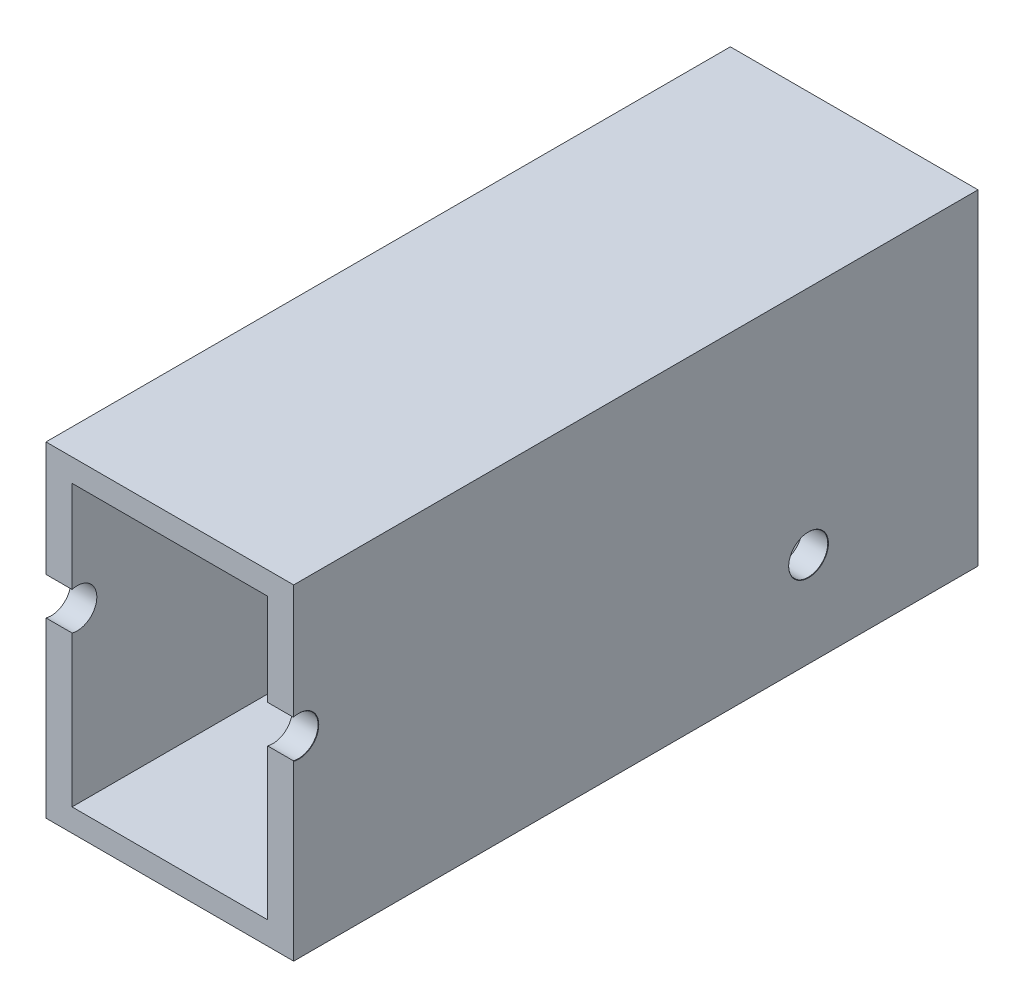
ISO-10303-21;
HEADER;
FILE_DESCRIPTION(('STEP AP214'),'2;1');
FILE_NAME('part.step','',(''),(''),'','','');
FILE_SCHEMA(('AUTOMOTIVE_DESIGN { 1 0 10303 214 1 1 1 1 }'));
ENDSEC;
DATA;
#1=APPLICATION_CONTEXT('core data for automotive mechanical design processes');
#2=APPLICATION_PROTOCOL_DEFINITION('international standard','automotive_design',2000,#1);
#3=PRODUCT_CONTEXT('',#1,'mechanical');
#4=PRODUCT('Part','Part','',(#3));
#5=PRODUCT_RELATED_PRODUCT_CATEGORY('part','',(#4));
#6=PRODUCT_DEFINITION_FORMATION('','',#4);
#7=PRODUCT_DEFINITION_CONTEXT('part definition',#1,'design');
#8=PRODUCT_DEFINITION('design','',#6,#7);
#9=PRODUCT_DEFINITION_SHAPE('','',#8);
#10=(LENGTH_UNIT() NAMED_UNIT(*) SI_UNIT(.MILLI.,.METRE.));
#11=(NAMED_UNIT(*) PLANE_ANGLE_UNIT() SI_UNIT($,.RADIAN.));
#12=(NAMED_UNIT(*) SI_UNIT($,.STERADIAN.) SOLID_ANGLE_UNIT());
#13=UNCERTAINTY_MEASURE_WITH_UNIT(LENGTH_MEASURE(1.E-05),#10,'distance_accuracy_value','');
#14=(GEOMETRIC_REPRESENTATION_CONTEXT(3) GLOBAL_UNCERTAINTY_ASSIGNED_CONTEXT((#13)) GLOBAL_UNIT_ASSIGNED_CONTEXT((#10,
#11,#12)) REPRESENTATION_CONTEXT('',''));
#15=CARTESIAN_POINT('',(0.,0.,0.));
#16=DIRECTION('',(0.,0.,1.));
#17=DIRECTION('',(1.,0.,0.));
#18=AXIS2_PLACEMENT_3D('',#15,#16,#17);
#19=CARTESIAN_POINT('',(-7.5,0.,21.25));
#20=DIRECTION('',(0.,0.,-1.));
#21=DIRECTION('',(0.,1.,0.));
#22=AXIS2_PLACEMENT_3D('',#19,#20,#21);
#23=PLANE('',#22);
#24=DIRECTION('',(0.,-1.,0.));
#25=VECTOR('',#24,1.);
#26=CARTESIAN_POINT('',(-9.5,0.,21.25));
#27=LINE('',#26,#25);
#28=CARTESIAN_POINT('',(-9.5,12.5,21.25));
#29=VERTEX_POINT('',#28);
#30=CARTESIAN_POINT('',(-9.5,3.69568322948009,21.25));
#31=VERTEX_POINT('',#30);
#32=EDGE_CURVE('E191',#29,#31,#27,.T.);
#33=ORIENTED_EDGE('',*,*,#32,.T.);
#34=DIRECTION('',(1.,0.,0.));
#35=VECTOR('',#34,1.);
#36=CARTESIAN_POINT('',(9.5,3.69568322948009,21.25));
#37=LINE('',#36,#35);
#38=CARTESIAN_POINT('',(-7.5,3.69568322948009,21.25));
#39=VERTEX_POINT('',#38);
#40=EDGE_CURVE('E51',#31,#39,#37,.T.);
#41=ORIENTED_EDGE('',*,*,#40,.T.);
#42=DIRECTION('',(0.,-1.,0.));
#43=VECTOR('',#42,1.);
#44=CARTESIAN_POINT('',(-7.5,0.,21.25));
#45=LINE('',#44,#43);
#46=CARTESIAN_POINT('',(-7.5,10.75,21.25));
#47=VERTEX_POINT('',#46);
#48=EDGE_CURVE('E312',#47,#39,#45,.T.);
#49=ORIENTED_EDGE('',*,*,#48,.F.);
#50=DIRECTION('',(1.,0.,0.));
#51=VECTOR('',#50,1.);
#52=CARTESIAN_POINT('',(-7.5,10.75,21.25));
#53=LINE('',#52,#51);
#54=CARTESIAN_POINT('',(7.5,10.75,21.25));
#55=VERTEX_POINT('',#54);
#56=EDGE_CURVE('E242',#47,#55,#53,.T.);
#57=ORIENTED_EDGE('',*,*,#56,.T.);
#58=DIRECTION('',(0.,-1.,0.));
#59=VECTOR('',#58,1.);
#60=CARTESIAN_POINT('',(7.5,0.,21.25));
#61=LINE('',#60,#59);
#62=CARTESIAN_POINT('',(7.5,3.69568322948009,21.25));
#63=VERTEX_POINT('',#62);
#64=EDGE_CURVE('E169',#55,#63,#61,.T.);
#65=ORIENTED_EDGE('',*,*,#64,.T.);
#66=CARTESIAN_POINT('',(9.475,3.69568322948009,21.25));
#67=VERTEX_POINT('',#66);
#68=EDGE_CURVE('E154',#63,#67,#37,.T.);
#69=ORIENTED_EDGE('',*,*,#68,.T.);
#70=CARTESIAN_POINT('',(11.3302614743773,-1.08133300068324,21.25));
#71=CARTESIAN_POINT('',(11.2309803775833,-0.981335513312061,21.25));
#72=CARTESIAN_POINT('',(11.1317281221365,-0.881309357235575,21.25));
#73=CARTESIAN_POINT('',(10.9332865546632,-0.68114926136724,21.25));
#74=CARTESIAN_POINT('',(10.8340972622279,-0.581015302154332,21.25));
#75=CARTESIAN_POINT('',(10.63537123852,-0.380168867834246,21.25));
#76=CARTESIAN_POINT('',(10.5358350370868,-0.279455868209956,21.25));
#77=CARTESIAN_POINT('',(10.3369497630987,-0.0778901348270776,21.25));
#78=CARTESIAN_POINT('',(10.2376006533995,0.0229625622894656,21.25));
#79=CARTESIAN_POINT('',(10.0074517335826,0.257141783862788,21.25));
#80=CARTESIAN_POINT('',(9.87673927839701,0.390554344658732,21.25));
#81=CARTESIAN_POINT('',(9.68119619631496,0.591287229243559,21.25));
#82=CARTESIAN_POINT('',(9.61607752419276,0.658326746048358,21.25));
#83=CARTESIAN_POINT('',(9.48612807222678,0.792673397943311,21.25));
#84=CARTESIAN_POINT('',(9.42129726854015,0.859980509960264,21.25));
#85=CARTESIAN_POINT('',(9.292294141253,0.994752497782797,21.25));
#86=CARTESIAN_POINT('',(9.22812027551293,1.06221589260616,21.25));
#87=CARTESIAN_POINT('',(9.10043172206804,1.19780428437442,21.25));
#88=CARTESIAN_POINT('',(9.03691725225311,1.26592948646065,21.25));
#89=CARTESIAN_POINT('',(8.91114059440442,1.40315951622252,21.25));
#90=CARTESIAN_POINT('',(8.84887672594501,1.47226278223949,21.25));
#91=CARTESIAN_POINT('',(8.75730377220609,1.57747735566534,21.25));
#92=CARTESIAN_POINT('',(8.72709078318992,1.61279956017969,21.25));
#93=CARTESIAN_POINT('',(8.667606001348,1.68422546158053,21.25));
#94=CARTESIAN_POINT('',(8.63833401369529,1.72032899407524,21.25));
#95=CARTESIAN_POINT('',(8.60023753377843,1.7693949559765,21.25));
#96=CARTESIAN_POINT('',(8.59072746500543,1.78182448353028,21.25));
#97=CARTESIAN_POINT('',(8.57192291597421,1.80684629633006,21.25));
#98=CARTESIAN_POINT('',(8.56262844684799,1.81943858992807,21.25));
#99=CARTESIAN_POINT('',(8.53511608654561,1.85752025719943,21.25));
#100=CARTESIAN_POINT('',(8.5172853988457,1.88329387599684,21.25));
#101=CARTESIAN_POINT('',(8.48340507863868,1.93556699506189,21.25));
#102=CARTESIAN_POINT('',(8.46733679994129,1.96205423058836,21.25));
#103=CARTESIAN_POINT('',(8.43767535848506,2.01636334986426,21.25));
#104=CARTESIAN_POINT('',(8.42407774788038,2.04418271897338,21.25));
#105=CARTESIAN_POINT('',(8.40205950303906,2.09857183312967,21.25));
#106=CARTESIAN_POINT('',(8.3932511742267,2.12497754687495,21.25));
#107=CARTESIAN_POINT('',(8.38045890353831,2.17881224923634,21.25));
#108=CARTESIAN_POINT('',(8.37644033144554,2.20623239629215,21.25));
#109=CARTESIAN_POINT('',(8.37420736540521,2.26156932034529,21.25));
#110=CARTESIAN_POINT('',(8.37604394434919,2.28948834314135,21.25));
#111=CARTESIAN_POINT('',(8.38510528676584,2.34453859129243,21.25));
#112=CARTESIAN_POINT('',(8.39236293336286,2.37166395464155,21.25));
#113=CARTESIAN_POINT('',(8.41053467910711,2.42402913385564,21.25));
#114=CARTESIAN_POINT('',(8.42137991415832,2.44929426165097,21.25));
#115=CARTESIAN_POINT('',(8.4454965533683,2.49865937626392,21.25));
#116=CARTESIAN_POINT('',(8.45877238765339,2.52275713226477,21.25));
#117=CARTESIAN_POINT('',(8.48699674793282,2.57016460066048,21.25));
#118=CARTESIAN_POINT('',(8.50195641988001,2.59346754951483,21.25));
#119=CARTESIAN_POINT('',(8.53293090274845,2.63932198909202,21.25));
#120=CARTESIAN_POINT('',(8.54894474728199,2.6618741402971,21.25));
#121=CARTESIAN_POINT('',(8.5833558638373,2.70866423009197,21.25));
#122=CARTESIAN_POINT('',(8.60183110754681,2.73284442657906,21.25));
#123=CARTESIAN_POINT('',(8.63940890161686,2.78071403800777,21.25));
#124=CARTESIAN_POINT('',(8.65851153141691,2.80440339017462,21.25));
#125=CARTESIAN_POINT('',(8.7165038751272,2.87494229576016,21.25));
#126=CARTESIAN_POINT('',(8.7560615356997,2.92124099310556,21.25));
#127=CARTESIAN_POINT('',(8.83623911790369,3.01303631928519,21.25));
#128=CARTESIAN_POINT('',(8.87686072078653,3.05853146141098,21.25));
#129=CARTESIAN_POINT('',(8.95872681091827,3.14893459726308,21.25));
#130=CARTESIAN_POINT('',(8.99997112763229,3.19384274567476,21.25));
#131=CARTESIAN_POINT('',(9.12402899985642,3.3276841196992,21.25));
#132=CARTESIAN_POINT('',(9.20745103613306,3.41605165373594,21.25));
#133=CARTESIAN_POINT('',(9.37503005278347,3.59192696169855,21.25));
#134=CARTESIAN_POINT('',(9.45918628578618,3.67943545229123,21.25));
#135=CARTESIAN_POINT('',(9.69104229213873,3.91923679878378,21.25));
#136=CARTESIAN_POINT('',(9.83922250452811,4.07106478581772,21.25));
#137=CARTESIAN_POINT('',(10.1362816844928,4.37414546706406,21.25));
#138=CARTESIAN_POINT('',(10.285160894941,4.52539792222081,21.25));
#139=CARTESIAN_POINT('',(10.5833169110932,4.82758301061007,21.25));
#140=CARTESIAN_POINT('',(10.7325938045559,4.978515557274,21.25));
#141=CARTESIAN_POINT('',(11.0313179681338,5.28009279543818,21.25));
#142=CARTESIAN_POINT('',(11.1807651465657,5.43073757772818,21.25));
#143=CARTESIAN_POINT('',(11.3302614743773,5.58133300068323,21.25));
#144=B_SPLINE_CURVE_WITH_KNOTS('',3,(#70,#71,#72,#73,#74,#75,#76,#77,#78,#79,#80,#81,#82,#83,
#84,#85,#86,#87,#88,#89,#90,#91,#92,#93,#94,#95,#96,#97,#98,#99,#100,#101,#102,#103,#104,#105,
#106,#107,#108,#109,#110,#111,#112,#113,#114,#115,#116,#117,#118,#119,#120,#121,#122,#123,#124,
#125,#126,#127,#128,#129,#130,#131,#132,#133,#134,#135,#136,#137,#138,#139,#140,#141,#142,#143),
.UNSPECIFIED.,.F.,.F.,(4,2,2,2,2,2,2,2,2,2,2,2,2,2,2,2,2,2,2,2,2,2,2,2,2,2,2,2,2,2,2,2,2,2,2,2,
4),(0.,0.422736472160644,0.845569642284197,1.27036950823582,1.69507355723187,2.25539456173061,
2.53577342309307,2.81612861176439,3.09545686125641,3.37487464796268,3.65388776116447,
3.7933227617274,3.9327287049636,3.97967774446792,4.0266292027077,4.12061047518204,
4.21347498855554,4.30617062841179,4.38936828544211,4.4719606974444,4.55527408706324,
4.63909698544142,4.72139617496848,4.8038468878758,4.88687961759052,4.9698372614113,
5.06111409250962,5.15240252596416,5.33506113599047,5.51802824449046,5.70094612361156,
6.06550533835863,6.42972890666016,7.06618348054727,7.70287854310779,8.33972819394249,
8.97632387812301),.UNSPECIFIED.);
#145=CARTESIAN_POINT('',(9.5,3.72160626527614,21.25));
#146=VERTEX_POINT('',#145);
#147=EDGE_CURVE('E147',#67,#146,#144,.T.);
#148=ORIENTED_EDGE('',*,*,#147,.T.);
#149=DIRECTION('',(0.,-1.,0.));
#150=VECTOR('',#149,1.);
#151=CARTESIAN_POINT('',(9.5,0.,21.25));
#152=LINE('',#151,#150);
#153=CARTESIAN_POINT('',(9.5,12.5,21.25));
#154=VERTEX_POINT('',#153);
#155=EDGE_CURVE('E306',#154,#146,#152,.T.);
#156=ORIENTED_EDGE('',*,*,#155,.F.);
#157=DIRECTION('',(1.,0.,0.));
#158=VECTOR('',#157,1.);
#159=CARTESIAN_POINT('',(-7.5,12.5,21.25));
#160=LINE('',#159,#158);
#161=EDGE_CURVE('E222',#29,#154,#160,.T.);
#162=ORIENTED_EDGE('',*,*,#161,.F.);
#163=EDGE_LOOP('',(#33,#41,#49,#57,#65,#69,#148,#156,#162));
#164=FACE_BOUND('',#163,.T.);
#165=ADVANCED_FACE('F43',(#164),#23,.F.);
#166=CARTESIAN_POINT('',(-7.5,12.5,0.));
#167=DIRECTION('',(0.,-1.,0.));
#168=DIRECTION('',(0.,0.,-1.));
#169=AXIS2_PLACEMENT_3D('',#166,#167,#168);
#170=PLANE('',#169);
#171=ORIENTED_EDGE('',*,*,#161,.T.);
#172=DIRECTION('',(0.,0.,1.));
#173=VECTOR('',#172,1.);
#174=CARTESIAN_POINT('',(9.5,12.5,0.));
#175=LINE('',#174,#173);
#176=CARTESIAN_POINT('',(9.5,12.5,-31.25));
#177=VERTEX_POINT('',#176);
#178=EDGE_CURVE('E301',#177,#154,#175,.T.);
#179=ORIENTED_EDGE('',*,*,#178,.F.);
#180=DIRECTION('',(1.,0.,0.));
#181=VECTOR('',#180,1.);
#182=CARTESIAN_POINT('',(-7.5,12.5,-31.25));
#183=LINE('',#182,#181);
#184=CARTESIAN_POINT('',(-9.5,12.5,-31.25));
#185=VERTEX_POINT('',#184);
#186=EDGE_CURVE('E158',#185,#177,#183,.T.);
#187=ORIENTED_EDGE('',*,*,#186,.F.);
#188=DIRECTION('',(0.,0.,1.));
#189=VECTOR('',#188,1.);
#190=CARTESIAN_POINT('',(-9.5,12.5,0.));
#191=LINE('',#190,#189);
#192=EDGE_CURVE('E188',#185,#29,#191,.T.);
#193=ORIENTED_EDGE('',*,*,#192,.T.);
#194=EDGE_LOOP('',(#171,#179,#187,#193));
#195=FACE_BOUND('',#194,.T.);
#196=ADVANCED_FACE('F44',(#195),#170,.F.);
#197=CARTESIAN_POINT('',(-7.5,0.,-31.25));
#198=DIRECTION('',(0.,0.,-1.));
#199=DIRECTION('',(0.,1.,0.));
#200=AXIS2_PLACEMENT_3D('',#197,#198,#199);
#201=PLANE('',#200);
#202=ORIENTED_EDGE('',*,*,#186,.T.);
#203=DIRECTION('',(0.,1.,0.));
#204=VECTOR('',#203,1.);
#205=CARTESIAN_POINT('',(9.5,0.,-31.25));
#206=LINE('',#205,#204);
#207=CARTESIAN_POINT('',(9.5,-12.5,-31.25));
#208=VERTEX_POINT('',#207);
#209=EDGE_CURVE('E195',#208,#177,#206,.T.);
#210=ORIENTED_EDGE('',*,*,#209,.F.);
#211=DIRECTION('',(1.,0.,0.));
#212=VECTOR('',#211,1.);
#213=CARTESIAN_POINT('',(-7.5,-12.5,-31.25));
#214=LINE('',#213,#212);
#215=CARTESIAN_POINT('',(-9.5,-12.5,-31.25));
#216=VERTEX_POINT('',#215);
#217=EDGE_CURVE('E221',#216,#208,#214,.T.);
#218=ORIENTED_EDGE('',*,*,#217,.F.);
#219=DIRECTION('',(0.,1.,0.));
#220=VECTOR('',#219,1.);
#221=CARTESIAN_POINT('',(-9.5,0.,-31.25));
#222=LINE('',#221,#220);
#223=EDGE_CURVE('E313',#216,#185,#222,.T.);
#224=ORIENTED_EDGE('',*,*,#223,.T.);
#225=EDGE_LOOP('',(#202,#210,#218,#224));
#226=FACE_BOUND('',#225,.T.);
#227=ADVANCED_FACE('F278',(#226),#201,.T.);
#228=CARTESIAN_POINT('',(-7.5,-12.5,0.));
#229=DIRECTION('',(0.,-1.,0.));
#230=DIRECTION('',(0.,0.,-1.));
#231=AXIS2_PLACEMENT_3D('',#228,#229,#230);
#232=PLANE('',#231);
#233=ORIENTED_EDGE('',*,*,#217,.T.);
#234=DIRECTION('',(0.,0.,-1.));
#235=VECTOR('',#234,1.);
#236=CARTESIAN_POINT('',(9.5,-12.5,0.));
#237=LINE('',#236,#235);
#238=CARTESIAN_POINT('',(9.5,-12.5,21.25));
#239=VERTEX_POINT('',#238);
#240=EDGE_CURVE('E198',#239,#208,#237,.T.);
#241=ORIENTED_EDGE('',*,*,#240,.F.);
#242=DIRECTION('',(1.,0.,0.));
#243=VECTOR('',#242,1.);
#244=CARTESIAN_POINT('',(-7.5,-12.5,21.25));
#245=LINE('',#244,#243);
#246=CARTESIAN_POINT('',(-9.5,-12.5,21.25));
#247=VERTEX_POINT('',#246);
#248=EDGE_CURVE('E227',#247,#239,#245,.T.);
#249=ORIENTED_EDGE('',*,*,#248,.F.);
#250=DIRECTION('',(0.,0.,-1.));
#251=VECTOR('',#250,1.);
#252=CARTESIAN_POINT('',(-9.5,-12.5,0.));
#253=LINE('',#252,#251);
#254=EDGE_CURVE('E316',#247,#216,#253,.T.);
#255=ORIENTED_EDGE('',*,*,#254,.T.);
#256=EDGE_LOOP('',(#233,#241,#249,#255));
#257=FACE_BOUND('',#256,.T.);
#258=ADVANCED_FACE('F285',(#257),#232,.T.);
#259=CARTESIAN_POINT('',(-7.5,0.804316770519905,21.25));
#260=VERTEX_POINT('',#259);
#261=CARTESIAN_POINT('',(-7.5,-10.75,21.25));
#262=VERTEX_POINT('',#261);
#263=EDGE_CURVE('E314',#260,#262,#45,.T.);
#264=ORIENTED_EDGE('',*,*,#263,.F.);
#265=DIRECTION('',(1.,0.,0.));
#266=VECTOR('',#265,1.);
#267=CARTESIAN_POINT('',(9.5,0.804316770519905,21.25));
#268=LINE('',#267,#266);
#269=CARTESIAN_POINT('',(-9.5,0.804316770519906,21.25));
#270=VERTEX_POINT('',#269);
#271=EDGE_CURVE('E171',#260,#270,#268,.F.);
#272=ORIENTED_EDGE('',*,*,#271,.T.);
#273=EDGE_CURVE('E319',#270,#247,#27,.T.);
#274=ORIENTED_EDGE('',*,*,#273,.T.);
#275=ORIENTED_EDGE('',*,*,#248,.T.);
#276=CARTESIAN_POINT('',(9.5,0.778393734723854,21.25));
#277=VERTEX_POINT('',#276);
#278=EDGE_CURVE('E307',#277,#239,#152,.T.);
#279=ORIENTED_EDGE('',*,*,#278,.F.);
#280=CARTESIAN_POINT('',(9.475,0.804316770519903,21.25));
#281=VERTEX_POINT('',#280);
#282=EDGE_CURVE('E157',#277,#281,#144,.T.);
#283=ORIENTED_EDGE('',*,*,#282,.T.);
#284=CARTESIAN_POINT('',(7.5,0.804316770519905,21.25));
#285=VERTEX_POINT('',#284);
#286=EDGE_CURVE('E161',#281,#285,#268,.F.);
#287=ORIENTED_EDGE('',*,*,#286,.T.);
#288=CARTESIAN_POINT('',(7.5,-10.75,21.25));
#289=VERTEX_POINT('',#288);
#290=EDGE_CURVE('E181',#285,#289,#61,.T.);
#291=ORIENTED_EDGE('',*,*,#290,.T.);
#292=DIRECTION('',(1.,0.,0.));
#293=VECTOR('',#292,1.);
#294=CARTESIAN_POINT('',(-7.5,-10.75,21.25));
#295=LINE('',#294,#293);
#296=EDGE_CURVE('E229',#262,#289,#295,.T.);
#297=ORIENTED_EDGE('',*,*,#296,.F.);
#298=EDGE_LOOP('',(#264,#272,#274,#275,#279,#283,#287,#291,#297));
#299=FACE_BOUND('',#298,.T.);
#300=ADVANCED_FACE('F177',(#299),#23,.F.);
#301=CARTESIAN_POINT('',(-7.5,-10.75,0.));
#302=DIRECTION('',(0.,-1.,0.));
#303=DIRECTION('',(0.,0.,-1.));
#304=AXIS2_PLACEMENT_3D('',#301,#302,#303);
#305=PLANE('',#304);
#306=ORIENTED_EDGE('',*,*,#296,.T.);
#307=DIRECTION('',(0.,0.,-1.));
#308=VECTOR('',#307,1.);
#309=CARTESIAN_POINT('',(7.5,-10.75,0.));
#310=LINE('',#309,#308);
#311=CARTESIAN_POINT('',(7.5,-10.75,-21.25));
#312=VERTEX_POINT('',#311);
#313=EDGE_CURVE('E189',#289,#312,#310,.T.);
#314=ORIENTED_EDGE('',*,*,#313,.T.);
#315=DIRECTION('',(1.,0.,0.));
#316=VECTOR('',#315,1.);
#317=CARTESIAN_POINT('',(-7.5,-10.75,-21.25));
#318=LINE('',#317,#316);
#319=CARTESIAN_POINT('',(-7.5,-10.75,-21.25));
#320=VERTEX_POINT('',#319);
#321=EDGE_CURVE('E235',#320,#312,#318,.T.);
#322=ORIENTED_EDGE('',*,*,#321,.F.);
#323=DIRECTION('',(0.,0.,-1.));
#324=VECTOR('',#323,1.);
#325=CARTESIAN_POINT('',(-7.5,-10.75,0.));
#326=LINE('',#325,#324);
#327=EDGE_CURVE('E223',#262,#320,#326,.T.);
#328=ORIENTED_EDGE('',*,*,#327,.F.);
#329=EDGE_LOOP('',(#306,#314,#322,#328));
#330=FACE_BOUND('',#329,.T.);
#331=ADVANCED_FACE('F286',(#330),#305,.F.);
#332=CARTESIAN_POINT('',(-7.5,0.,-21.25));
#333=DIRECTION('',(0.,0.,-1.));
#334=DIRECTION('',(0.,1.,0.));
#335=AXIS2_PLACEMENT_3D('',#332,#333,#334);
#336=PLANE('',#335);
#337=ORIENTED_EDGE('',*,*,#321,.T.);
#338=DIRECTION('',(0.,1.,0.));
#339=VECTOR('',#338,1.);
#340=CARTESIAN_POINT('',(7.5,0.,-21.25));
#341=LINE('',#340,#339);
#342=CARTESIAN_POINT('',(7.5,-2.25,-21.25));
#343=VERTEX_POINT('',#342);
#344=EDGE_CURVE('E210',#312,#343,#341,.T.);
#345=ORIENTED_EDGE('',*,*,#344,.T.);
#346=DIRECTION('',(1.,0.,0.));
#347=VECTOR('',#346,1.);
#348=CARTESIAN_POINT('',(-7.5,-2.25,-21.25));
#349=LINE('',#348,#347);
#350=CARTESIAN_POINT('',(-7.5,-2.25,-21.25));
#351=VERTEX_POINT('',#350);
#352=EDGE_CURVE('E232',#351,#343,#349,.T.);
#353=ORIENTED_EDGE('',*,*,#352,.F.);
#354=DIRECTION('',(0.,1.,0.));
#355=VECTOR('',#354,1.);
#356=CARTESIAN_POINT('',(-7.5,0.,-21.25));
#357=LINE('',#356,#355);
#358=EDGE_CURVE('E217',#320,#351,#357,.T.);
#359=ORIENTED_EDGE('',*,*,#358,.F.);
#360=EDGE_LOOP('',(#337,#345,#353,#359));
#361=FACE_BOUND('',#360,.T.);
#362=ADVANCED_FACE('F375',(#361),#336,.F.);
#363=CARTESIAN_POINT('',(-7.5,-2.25,0.));
#364=DIRECTION('',(0.,1.,0.));
#365=DIRECTION('',(0.,0.,1.));
#366=AXIS2_PLACEMENT_3D('',#363,#364,#365);
#367=PLANE('',#366);
#368=ORIENTED_EDGE('',*,*,#352,.T.);
#369=DIRECTION('',(0.,0.,1.));
#370=VECTOR('',#369,1.);
#371=CARTESIAN_POINT('',(7.5,-2.25,0.));
#372=LINE('',#371,#370);
#373=CARTESIAN_POINT('',(7.5,-2.25,-15.25));
#374=VERTEX_POINT('',#373);
#375=EDGE_CURVE('E205',#343,#374,#372,.T.);
#376=ORIENTED_EDGE('',*,*,#375,.T.);
#377=DIRECTION('',(1.,0.,0.));
#378=VECTOR('',#377,1.);
#379=CARTESIAN_POINT('',(-7.5,-2.25,-15.25));
#380=LINE('',#379,#378);
#381=CARTESIAN_POINT('',(-7.5,-2.25,-15.25));
#382=VERTEX_POINT('',#381);
#383=EDGE_CURVE('E238',#382,#374,#380,.T.);
#384=ORIENTED_EDGE('',*,*,#383,.F.);
#385=DIRECTION('',(0.,0.,1.));
#386=VECTOR('',#385,1.);
#387=CARTESIAN_POINT('',(-7.5,-2.25,0.));
#388=LINE('',#387,#386);
#389=EDGE_CURVE('E220',#351,#382,#388,.T.);
#390=ORIENTED_EDGE('',*,*,#389,.F.);
#391=EDGE_LOOP('',(#368,#376,#384,#390));
#392=FACE_BOUND('',#391,.T.);
#393=ADVANCED_FACE('F372',(#392),#367,.F.);
#394=CARTESIAN_POINT('',(-7.5,0.,-15.25));
#395=DIRECTION('',(0.,0.,1.));
#396=DIRECTION('',(0.,-1.,0.));
#397=AXIS2_PLACEMENT_3D('',#394,#395,#396);
#398=PLANE('',#397);
#399=ORIENTED_EDGE('',*,*,#383,.T.);
#400=DIRECTION('',(0.,-1.,0.));
#401=VECTOR('',#400,1.);
#402=CARTESIAN_POINT('',(7.5,0.,-15.25));
#403=LINE('',#402,#401);
#404=CARTESIAN_POINT('',(7.5,10.75,-15.25));
#405=VERTEX_POINT('',#404);
#406=EDGE_CURVE('E204',#405,#374,#403,.T.);
#407=ORIENTED_EDGE('',*,*,#406,.F.);
#408=DIRECTION('',(1.,0.,0.));
#409=VECTOR('',#408,1.);
#410=CARTESIAN_POINT('',(-7.5,10.75,-15.25));
#411=LINE('',#410,#409);
#412=CARTESIAN_POINT('',(-7.5,10.75,-15.25));
#413=VERTEX_POINT('',#412);
#414=EDGE_CURVE('E241',#413,#405,#411,.T.);
#415=ORIENTED_EDGE('',*,*,#414,.F.);
#416=DIRECTION('',(0.,-1.,0.));
#417=VECTOR('',#416,1.);
#418=CARTESIAN_POINT('',(-7.5,0.,-15.25));
#419=LINE('',#418,#417);
#420=EDGE_CURVE('E211',#413,#382,#419,.T.);
#421=ORIENTED_EDGE('',*,*,#420,.T.);
#422=EDGE_LOOP('',(#399,#407,#415,#421));
#423=FACE_BOUND('',#422,.T.);
#424=ADVANCED_FACE('F377',(#423),#398,.T.);
#425=CARTESIAN_POINT('',(-7.5,10.75,0.));
#426=DIRECTION('',(0.,-1.,0.));
#427=DIRECTION('',(0.,0.,-1.));
#428=AXIS2_PLACEMENT_3D('',#425,#426,#427);
#429=PLANE('',#428);
#430=ORIENTED_EDGE('',*,*,#414,.T.);
#431=DIRECTION('',(0.,0.,-1.));
#432=VECTOR('',#431,1.);
#433=CARTESIAN_POINT('',(7.5,10.75,0.));
#434=LINE('',#433,#432);
#435=EDGE_CURVE('E199',#55,#405,#434,.T.);
#436=ORIENTED_EDGE('',*,*,#435,.F.);
#437=ORIENTED_EDGE('',*,*,#56,.F.);
#438=DIRECTION('',(0.,0.,-1.));
#439=VECTOR('',#438,1.);
#440=CARTESIAN_POINT('',(-7.5,10.75,0.));
#441=LINE('',#440,#439);
#442=EDGE_CURVE('E212',#47,#413,#441,.T.);
#443=ORIENTED_EDGE('',*,*,#442,.T.);
#444=EDGE_LOOP('',(#430,#436,#437,#443));
#445=FACE_BOUND('',#444,.T.);
#446=ADVANCED_FACE('F279',(#445),#429,.T.);
#447=CARTESIAN_POINT('',(7.5,0.,0.));
#448=DIRECTION('',(1.,0.,0.));
#449=DIRECTION('',(0.,0.,-1.));
#450=AXIS2_PLACEMENT_3D('',#447,#448,#449);
#451=PLANE('',#450);
#452=CARTESIAN_POINT('',(7.5,-5.24999999999999,-18.25));
#453=DIRECTION('',(1.,0.,0.));
#454=DIRECTION('',(0.,0.,-1.));
#455=AXIS2_PLACEMENT_3D('',#452,#453,#454);
#456=CIRCLE('',#455,1.5);
#457=CARTESIAN_POINT('',(7.5,-5.24999999999999,-19.75));
#458=VERTEX_POINT('',#457);
#459=EDGE_CURVE('E328',#458,#458,#456,.T.);
#460=ORIENTED_EDGE('',*,*,#459,.T.);
#461=EDGE_LOOP('',(#460));
#462=FACE_BOUND('',#461,.T.);
#463=ORIENTED_EDGE('',*,*,#290,.F.);
#464=CARTESIAN_POINT('',(7.5,2.25,20.85));
#465=DIRECTION('',(1.,0.,0.));
#466=DIRECTION('',(0.,0.,-1.));
#467=AXIS2_PLACEMENT_3D('',#464,#465,#466);
#468=CIRCLE('',#467,1.5);
#469=EDGE_CURVE('E187',#285,#63,#468,.T.);
#470=ORIENTED_EDGE('',*,*,#469,.T.);
#471=ORIENTED_EDGE('',*,*,#64,.F.);
#472=ORIENTED_EDGE('',*,*,#435,.T.);
#473=ORIENTED_EDGE('',*,*,#406,.T.);
#474=ORIENTED_EDGE('',*,*,#375,.F.);
#475=ORIENTED_EDGE('',*,*,#344,.F.);
#476=ORIENTED_EDGE('',*,*,#313,.F.);
#477=EDGE_LOOP('',(#463,#470,#471,#472,#473,#474,#475,#476));
#478=FACE_BOUND('',#477,.T.);
#479=ADVANCED_FACE('F184',(#462,#478),#451,.F.);
#480=CARTESIAN_POINT('',(9.5,0.,0.));
#481=DIRECTION('',(1.,0.,0.));
#482=DIRECTION('',(0.,0.,-1.));
#483=AXIS2_PLACEMENT_3D('',#480,#481,#482);
#484=PLANE('',#483);
#485=CARTESIAN_POINT('',(9.5,-5.24999999999999,-18.25));
#486=DIRECTION('',(1.,0.,0.));
#487=DIRECTION('',(0.,0.,-1.));
#488=AXIS2_PLACEMENT_3D('',#485,#486,#487);
#489=CIRCLE('',#488,1.525);
#490=CARTESIAN_POINT('',(9.5,-5.24999999999999,-19.775));
#491=VERTEX_POINT('',#490);
#492=EDGE_CURVE('E338',#491,#491,#489,.T.);
#493=ORIENTED_EDGE('',*,*,#492,.F.);
#494=EDGE_LOOP('',(#493));
#495=FACE_BOUND('',#494,.T.);
#496=CARTESIAN_POINT('',(9.5,2.25,20.85));
#497=DIRECTION('',(1.,0.,0.));
#498=DIRECTION('',(0.,0.,-1.));
#499=AXIS2_PLACEMENT_3D('',#496,#497,#498);
#500=CIRCLE('',#499,1.525);
#501=EDGE_CURVE('E61',#277,#146,#500,.T.);
#502=ORIENTED_EDGE('',*,*,#501,.F.);
#503=ORIENTED_EDGE('',*,*,#278,.T.);
#504=ORIENTED_EDGE('',*,*,#240,.T.);
#505=ORIENTED_EDGE('',*,*,#209,.T.);
#506=ORIENTED_EDGE('',*,*,#178,.T.);
#507=ORIENTED_EDGE('',*,*,#155,.T.);
#508=EDGE_LOOP('',(#502,#503,#504,#505,#506,#507));
#509=FACE_BOUND('',#508,.T.);
#510=ADVANCED_FACE('F272',(#495,#509),#484,.T.);
#511=CARTESIAN_POINT('',(-7.5,0.,0.));
#512=DIRECTION('',(-1.,0.,0.));
#513=DIRECTION('',(0.,0.,-1.));
#514=AXIS2_PLACEMENT_3D('',#511,#512,#513);
#515=PLANE('',#514);
#516=CARTESIAN_POINT('',(-7.5,-5.24999999999999,-18.25));
#517=DIRECTION('',(-1.,0.,0.));
#518=DIRECTION('',(0.,0.,1.));
#519=AXIS2_PLACEMENT_3D('',#516,#517,#518);
#520=CIRCLE('',#519,1.5);
#521=CARTESIAN_POINT('',(-7.5,-5.24999999999999,-16.75));
#522=VERTEX_POINT('',#521);
#523=EDGE_CURVE('E333',#522,#522,#520,.T.);
#524=ORIENTED_EDGE('',*,*,#523,.T.);
#525=EDGE_LOOP('',(#524));
#526=FACE_BOUND('',#525,.T.);
#527=ORIENTED_EDGE('',*,*,#48,.T.);
#528=CARTESIAN_POINT('',(-7.5,2.25,20.85));
#529=DIRECTION('',(-1.,0.,0.));
#530=DIRECTION('',(0.,0.,1.));
#531=AXIS2_PLACEMENT_3D('',#528,#529,#530);
#532=CIRCLE('',#531,1.5);
#533=EDGE_CURVE('E165',#39,#260,#532,.T.);
#534=ORIENTED_EDGE('',*,*,#533,.T.);
#535=ORIENTED_EDGE('',*,*,#263,.T.);
#536=ORIENTED_EDGE('',*,*,#327,.T.);
#537=ORIENTED_EDGE('',*,*,#358,.T.);
#538=ORIENTED_EDGE('',*,*,#389,.T.);
#539=ORIENTED_EDGE('',*,*,#420,.F.);
#540=ORIENTED_EDGE('',*,*,#442,.F.);
#541=EDGE_LOOP('',(#527,#534,#535,#536,#537,#538,#539,#540));
#542=FACE_BOUND('',#541,.T.);
#543=ADVANCED_FACE('F269',(#526,#542),#515,.F.);
#544=CARTESIAN_POINT('',(-9.5,0.,0.));
#545=DIRECTION('',(-1.,0.,0.));
#546=DIRECTION('',(0.,0.,-1.));
#547=AXIS2_PLACEMENT_3D('',#544,#545,#546);
#548=PLANE('',#547);
#549=CARTESIAN_POINT('',(-9.5,-5.24999999999999,-18.25));
#550=DIRECTION('',(1.,0.,0.));
#551=DIRECTION('',(0.,0.,-1.));
#552=AXIS2_PLACEMENT_3D('',#549,#550,#551);
#553=CIRCLE('',#552,1.5);
#554=CARTESIAN_POINT('',(-9.5,-5.24999999999999,-19.75));
#555=VERTEX_POINT('',#554);
#556=EDGE_CURVE('E335',#555,#555,#553,.T.);
#557=ORIENTED_EDGE('',*,*,#556,.T.);
#558=EDGE_LOOP('',(#557));
#559=FACE_BOUND('',#558,.T.);
#560=CARTESIAN_POINT('',(-9.5,2.25,20.85));
#561=DIRECTION('',(-1.,0.,0.));
#562=DIRECTION('',(0.,0.,1.));
#563=AXIS2_PLACEMENT_3D('',#560,#561,#562);
#564=CIRCLE('',#563,1.5);
#565=EDGE_CURVE('E11',#31,#270,#564,.T.);
#566=ORIENTED_EDGE('',*,*,#565,.F.);
#567=ORIENTED_EDGE('',*,*,#32,.F.);
#568=ORIENTED_EDGE('',*,*,#192,.F.);
#569=ORIENTED_EDGE('',*,*,#223,.F.);
#570=ORIENTED_EDGE('',*,*,#254,.F.);
#571=ORIENTED_EDGE('',*,*,#273,.F.);
#572=EDGE_LOOP('',(#566,#567,#568,#569,#570,#571));
#573=FACE_BOUND('',#572,.T.);
#574=ADVANCED_FACE('F256',(#559,#573),#548,.T.);
#575=CARTESIAN_POINT('',(9.5,2.25,20.85));
#576=DIRECTION('',(1.,0.,0.));
#577=DIRECTION('',(0.,0.,-1.));
#578=AXIS2_PLACEMENT_3D('',#575,#576,#577);
#579=CONICAL_SURFACE('',#578,1.525,0.785398163397474);
#580=ORIENTED_EDGE('',*,*,#501,.T.);
#581=ORIENTED_EDGE('',*,*,#147,.F.);
#582=CARTESIAN_POINT('',(9.475,2.25,20.85));
#583=DIRECTION('',(1.,0.,0.));
#584=DIRECTION('',(0.,0.,-1.));
#585=AXIS2_PLACEMENT_3D('',#582,#583,#584);
#586=CIRCLE('',#585,1.5);
#587=EDGE_CURVE('E146',#281,#67,#586,.T.);
#588=ORIENTED_EDGE('',*,*,#587,.F.);
#589=ORIENTED_EDGE('',*,*,#282,.F.);
#590=EDGE_LOOP('',(#580,#581,#588,#589));
#591=FACE_BOUND('',#590,.T.);
#592=ADVANCED_FACE('F149',(#591),#579,.F.);
#593=CARTESIAN_POINT('',(9.5,2.25,20.85));
#594=DIRECTION('',(1.,0.,0.));
#595=DIRECTION('',(0.,0.,-1.));
#596=AXIS2_PLACEMENT_3D('',#593,#594,#595);
#597=CYLINDRICAL_SURFACE('',#596,1.5);
#598=ORIENTED_EDGE('',*,*,#469,.F.);
#599=ORIENTED_EDGE('',*,*,#286,.F.);
#600=ORIENTED_EDGE('',*,*,#587,.T.);
#601=ORIENTED_EDGE('',*,*,#68,.F.);
#602=EDGE_LOOP('',(#598,#599,#600,#601));
#603=FACE_BOUND('',#602,.T.);
#604=ADVANCED_FACE('F156',(#603),#597,.F.);
#605=ORIENTED_EDGE('',*,*,#565,.T.);
#606=ORIENTED_EDGE('',*,*,#271,.F.);
#607=ORIENTED_EDGE('',*,*,#533,.F.);
#608=ORIENTED_EDGE('',*,*,#40,.F.);
#609=EDGE_LOOP('',(#605,#606,#607,#608));
#610=FACE_BOUND('',#609,.T.);
#611=ADVANCED_FACE('F262',(#610),#597,.F.);
#612=CARTESIAN_POINT('',(9.5,-5.24999999999999,-18.25));
#613=DIRECTION('',(1.,0.,0.));
#614=DIRECTION('',(0.,0.,-1.));
#615=AXIS2_PLACEMENT_3D('',#612,#613,#614);
#616=CONICAL_SURFACE('',#615,1.525,0.785398163397474);
#617=CARTESIAN_POINT('',(9.475,-5.24999999999999,-18.25));
#618=DIRECTION('',(1.,0.,0.));
#619=DIRECTION('',(0.,0.,-1.));
#620=AXIS2_PLACEMENT_3D('',#617,#618,#619);
#621=CIRCLE('',#620,1.5);
#622=CARTESIAN_POINT('',(9.475,-5.24999999999999,-19.75));
#623=VERTEX_POINT('',#622);
#624=EDGE_CURVE('E340',#623,#623,#621,.T.);
#625=ORIENTED_EDGE('',*,*,#624,.F.);
#626=EDGE_LOOP('',(#625));
#627=FACE_BOUND('',#626,.T.);
#628=ORIENTED_EDGE('',*,*,#492,.T.);
#629=EDGE_LOOP('',(#628));
#630=FACE_BOUND('',#629,.T.);
#631=ADVANCED_FACE('F341',(#627,#630),#616,.F.);
#632=CARTESIAN_POINT('',(9.5,-5.24999999999999,-18.25));
#633=DIRECTION('',(1.,0.,0.));
#634=DIRECTION('',(0.,0.,-1.));
#635=AXIS2_PLACEMENT_3D('',#632,#633,#634);
#636=CYLINDRICAL_SURFACE('',#635,1.5);
#637=ORIENTED_EDGE('',*,*,#624,.T.);
#638=EDGE_LOOP('',(#637));
#639=FACE_BOUND('',#638,.T.);
#640=ORIENTED_EDGE('',*,*,#459,.F.);
#641=EDGE_LOOP('',(#640));
#642=FACE_BOUND('',#641,.T.);
#643=ADVANCED_FACE('F258',(#639,#642),#636,.F.);
#644=ORIENTED_EDGE('',*,*,#556,.F.);
#645=EDGE_LOOP('',(#644));
#646=FACE_BOUND('',#645,.T.);
#647=ORIENTED_EDGE('',*,*,#523,.F.);
#648=EDGE_LOOP('',(#647));
#649=FACE_BOUND('',#648,.T.);
#650=ADVANCED_FACE('F353',(#646,#649),#636,.F.);
#651=CLOSED_SHELL('',(#165,#196,#227,#258,#300,#331,#362,#393,#424,#446,#479,#510,#543,#574,
#592,#604,#611,#631,#643,#650));
#652=MANIFOLD_SOLID_BREP('B2',#651);
#653=ADVANCED_BREP_SHAPE_REPRESENTATION('',(#18,#652),#14);
#654=SHAPE_DEFINITION_REPRESENTATION(#9,#653);
ENDSEC;
END-ISO-10303-21;
